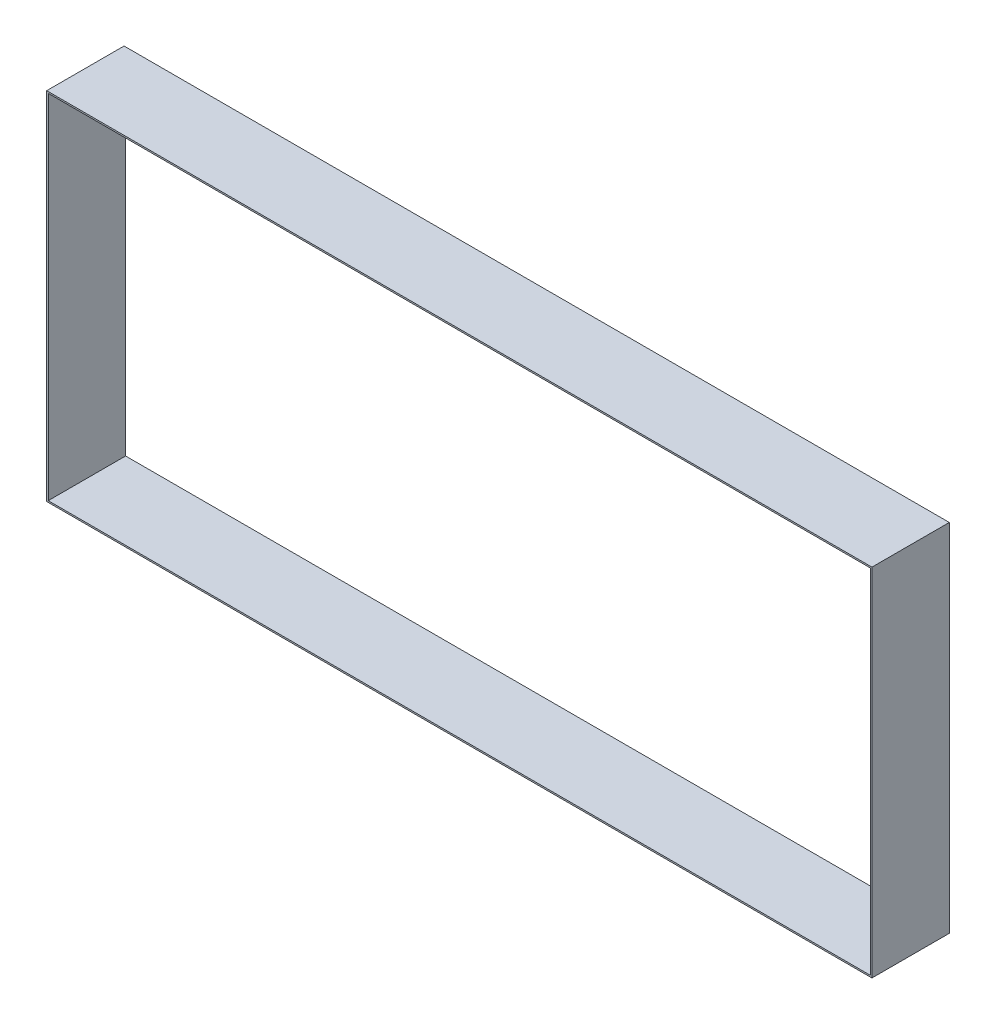
ISO-10303-21;
HEADER;
FILE_DESCRIPTION(('STEP AP214'),'2;1');
FILE_NAME('part.step','',(''),(''),'','','');
FILE_SCHEMA(('AUTOMOTIVE_DESIGN { 1 0 10303 214 1 1 1 1 }'));
ENDSEC;
DATA;
#1=APPLICATION_CONTEXT('core data for automotive mechanical design processes');
#2=APPLICATION_PROTOCOL_DEFINITION('international standard','automotive_design',2000,#1);
#3=PRODUCT_CONTEXT('',#1,'mechanical');
#4=PRODUCT('Part','Part','',(#3));
#5=PRODUCT_RELATED_PRODUCT_CATEGORY('part','',(#4));
#6=PRODUCT_DEFINITION_FORMATION('','',#4);
#7=PRODUCT_DEFINITION_CONTEXT('part definition',#1,'design');
#8=PRODUCT_DEFINITION('design','',#6,#7);
#9=PRODUCT_DEFINITION_SHAPE('','',#8);
#10=(LENGTH_UNIT() NAMED_UNIT(*) SI_UNIT(.MILLI.,.METRE.));
#11=(NAMED_UNIT(*) PLANE_ANGLE_UNIT() SI_UNIT($,.RADIAN.));
#12=(NAMED_UNIT(*) SI_UNIT($,.STERADIAN.) SOLID_ANGLE_UNIT());
#13=UNCERTAINTY_MEASURE_WITH_UNIT(LENGTH_MEASURE(1.E-05),#10,'distance_accuracy_value','');
#14=(GEOMETRIC_REPRESENTATION_CONTEXT(3) GLOBAL_UNCERTAINTY_ASSIGNED_CONTEXT((#13)) GLOBAL_UNIT_ASSIGNED_CONTEXT((#10,
#11,#12)) REPRESENTATION_CONTEXT('',''));
#15=CARTESIAN_POINT('',(0.,0.,0.));
#16=DIRECTION('',(0.,0.,1.));
#17=DIRECTION('',(1.,0.,0.));
#18=AXIS2_PLACEMENT_3D('',#15,#16,#17);
#19=CARTESIAN_POINT('',(0.,0.,50.));
#20=DIRECTION('',(0.,0.,1.));
#21=DIRECTION('',(1.,0.,0.));
#22=AXIS2_PLACEMENT_3D('',#19,#20,#21);
#23=PLANE('',#22);
#24=DIRECTION('',(0.,-1.,0.));
#25=VECTOR('',#24,1.);
#26=CARTESIAN_POINT('',(-57.8684020325567,31.1411992263056,50.));
#27=LINE('',#26,#25);
#28=CARTESIAN_POINT('',(-57.8684020325567,31.1411992263056,50.));
#29=VERTEX_POINT('',#28);
#30=CARTESIAN_POINT('',(-57.8684020325566,-198.858800773694,50.));
#31=VERTEX_POINT('',#30);
#32=EDGE_CURVE('E136',#29,#31,#27,.T.);
#33=ORIENTED_EDGE('',*,*,#32,.T.);
#34=DIRECTION('',(1.,0.,0.));
#35=VECTOR('',#34,1.);
#36=CARTESIAN_POINT('',(-57.8684020325566,-198.858800773694,50.));
#37=LINE('',#36,#35);
#38=CARTESIAN_POINT('',(475.531597967443,-198.858800773694,50.));
#39=VERTEX_POINT('',#38);
#40=EDGE_CURVE('E139',#31,#39,#37,.T.);
#41=ORIENTED_EDGE('',*,*,#40,.T.);
#42=DIRECTION('',(0.,1.,0.));
#43=VECTOR('',#42,1.);
#44=CARTESIAN_POINT('',(475.531597967443,31.1411992263056,50.));
#45=LINE('',#44,#43);
#46=CARTESIAN_POINT('',(475.531597967443,31.1411992263056,50.));
#47=VERTEX_POINT('',#46);
#48=EDGE_CURVE('E142',#39,#47,#45,.T.);
#49=ORIENTED_EDGE('',*,*,#48,.T.);
#50=DIRECTION('',(-1.,0.,0.));
#51=VECTOR('',#50,1.);
#52=CARTESIAN_POINT('',(-57.8684020325567,31.1411992263056,50.));
#53=LINE('',#52,#51);
#54=EDGE_CURVE('E144',#47,#29,#53,.T.);
#55=ORIENTED_EDGE('',*,*,#54,.T.);
#56=EDGE_LOOP('',(#33,#41,#49,#55));
#57=FACE_BOUND('',#56,.T.);
#58=DIRECTION('',(1.,0.,0.));
#59=VECTOR('',#58,1.);
#60=CARTESIAN_POINT('',(-56.8684020325567,-197.858800773694,50.));
#61=LINE('',#60,#59);
#62=CARTESIAN_POINT('',(-56.8684020325567,-197.858800773694,50.));
#63=VERTEX_POINT('',#62);
#64=CARTESIAN_POINT('',(474.531597967443,-197.858800773694,50.));
#65=VERTEX_POINT('',#64);
#66=EDGE_CURVE('E108',#63,#65,#61,.T.);
#67=ORIENTED_EDGE('',*,*,#66,.F.);
#68=DIRECTION('',(0.,-1.,0.));
#69=VECTOR('',#68,1.);
#70=CARTESIAN_POINT('',(-56.8684020325567,30.1411992263056,50.));
#71=LINE('',#70,#69);
#72=CARTESIAN_POINT('',(-56.8684020325567,30.1411992263056,50.));
#73=VERTEX_POINT('',#72);
#74=EDGE_CURVE('E100',#73,#63,#71,.T.);
#75=ORIENTED_EDGE('',*,*,#74,.F.);
#76=DIRECTION('',(-1.,0.,0.));
#77=VECTOR('',#76,1.);
#78=CARTESIAN_POINT('',(-56.8684020325567,30.1411992263056,50.));
#79=LINE('',#78,#77);
#80=CARTESIAN_POINT('',(474.531597967443,30.1411992263056,50.));
#81=VERTEX_POINT('',#80);
#82=EDGE_CURVE('E122',#81,#73,#79,.T.);
#83=ORIENTED_EDGE('',*,*,#82,.F.);
#84=DIRECTION('',(0.,1.,0.));
#85=VECTOR('',#84,1.);
#86=CARTESIAN_POINT('',(474.531597967443,30.1411992263056,50.));
#87=LINE('',#86,#85);
#88=EDGE_CURVE('E120',#65,#81,#87,.T.);
#89=ORIENTED_EDGE('',*,*,#88,.F.);
#90=EDGE_LOOP('',(#67,#75,#83,#89));
#91=FACE_BOUND('',#90,.T.);
#92=ADVANCED_FACE('F35',(#57,#91),#23,.T.);
#93=CARTESIAN_POINT('',(0.,0.,0.));
#94=DIRECTION('',(0.,0.,1.));
#95=DIRECTION('',(1.,0.,0.));
#96=AXIS2_PLACEMENT_3D('',#93,#94,#95);
#97=PLANE('',#96);
#98=DIRECTION('',(0.,-1.,0.));
#99=VECTOR('',#98,1.);
#100=CARTESIAN_POINT('',(-57.8684020325567,31.1411992263056,0.));
#101=LINE('',#100,#99);
#102=CARTESIAN_POINT('',(-57.8684020325567,31.1411992263056,0.));
#103=VERTEX_POINT('',#102);
#104=CARTESIAN_POINT('',(-57.8684020325566,-198.858800773694,0.));
#105=VERTEX_POINT('',#104);
#106=EDGE_CURVE('E116',#103,#105,#101,.T.);
#107=ORIENTED_EDGE('',*,*,#106,.F.);
#108=DIRECTION('',(-1.,0.,0.));
#109=VECTOR('',#108,1.);
#110=CARTESIAN_POINT('',(-57.8684020325567,31.1411992263056,0.));
#111=LINE('',#110,#109);
#112=CARTESIAN_POINT('',(475.531597967443,31.1411992263056,0.));
#113=VERTEX_POINT('',#112);
#114=EDGE_CURVE('E140',#113,#103,#111,.T.);
#115=ORIENTED_EDGE('',*,*,#114,.F.);
#116=DIRECTION('',(0.,1.,0.));
#117=VECTOR('',#116,1.);
#118=CARTESIAN_POINT('',(475.531597967443,31.1411992263056,0.));
#119=LINE('',#118,#117);
#120=CARTESIAN_POINT('',(475.531597967443,-198.858800773694,0.));
#121=VERTEX_POINT('',#120);
#122=EDGE_CURVE('E151',#121,#113,#119,.T.);
#123=ORIENTED_EDGE('',*,*,#122,.F.);
#124=DIRECTION('',(1.,0.,0.));
#125=VECTOR('',#124,1.);
#126=CARTESIAN_POINT('',(-57.8684020325566,-198.858800773694,0.));
#127=LINE('',#126,#125);
#128=EDGE_CURVE('E149',#105,#121,#127,.T.);
#129=ORIENTED_EDGE('',*,*,#128,.F.);
#130=EDGE_LOOP('',(#107,#115,#123,#129));
#131=FACE_BOUND('',#130,.T.);
#132=DIRECTION('',(0.,-1.,0.));
#133=VECTOR('',#132,1.);
#134=CARTESIAN_POINT('',(-56.8684020325567,30.1411992263056,0.));
#135=LINE('',#134,#133);
#136=CARTESIAN_POINT('',(-56.8684020325567,30.1411992263056,0.));
#137=VERTEX_POINT('',#136);
#138=CARTESIAN_POINT('',(-56.8684020325567,-197.858800773694,0.));
#139=VERTEX_POINT('',#138);
#140=EDGE_CURVE('E58',#137,#139,#135,.T.);
#141=ORIENTED_EDGE('',*,*,#140,.T.);
#142=DIRECTION('',(1.,0.,0.));
#143=VECTOR('',#142,1.);
#144=CARTESIAN_POINT('',(-56.8684020325567,-197.858800773694,0.));
#145=LINE('',#144,#143);
#146=CARTESIAN_POINT('',(474.531597967443,-197.858800773694,0.));
#147=VERTEX_POINT('',#146);
#148=EDGE_CURVE('E115',#139,#147,#145,.T.);
#149=ORIENTED_EDGE('',*,*,#148,.T.);
#150=DIRECTION('',(0.,1.,0.));
#151=VECTOR('',#150,1.);
#152=CARTESIAN_POINT('',(474.531597967443,30.1411992263056,0.));
#153=LINE('',#152,#151);
#154=CARTESIAN_POINT('',(474.531597967443,30.1411992263056,0.));
#155=VERTEX_POINT('',#154);
#156=EDGE_CURVE('E128',#147,#155,#153,.T.);
#157=ORIENTED_EDGE('',*,*,#156,.T.);
#158=DIRECTION('',(-1.,0.,0.));
#159=VECTOR('',#158,1.);
#160=CARTESIAN_POINT('',(-56.8684020325567,30.1411992263056,0.));
#161=LINE('',#160,#159);
#162=EDGE_CURVE('E109',#155,#137,#161,.T.);
#163=ORIENTED_EDGE('',*,*,#162,.T.);
#164=EDGE_LOOP('',(#141,#149,#157,#163));
#165=FACE_BOUND('',#164,.T.);
#166=ADVANCED_FACE('F169',(#131,#165),#97,.F.);
#167=CARTESIAN_POINT('',(-57.8684020325567,31.1411992263056,50.));
#168=DIRECTION('',(1.,0.,0.));
#169=DIRECTION('',(0.,1.,0.));
#170=AXIS2_PLACEMENT_3D('',#167,#168,#169);
#171=PLANE('',#170);
#172=ORIENTED_EDGE('',*,*,#106,.T.);
#173=DIRECTION('',(0.,0.,-1.));
#174=VECTOR('',#173,1.);
#175=CARTESIAN_POINT('',(-57.8684020325566,-198.858800773694,50.));
#176=LINE('',#175,#174);
#177=EDGE_CURVE('E11',#31,#105,#176,.T.);
#178=ORIENTED_EDGE('',*,*,#177,.F.);
#179=ORIENTED_EDGE('',*,*,#32,.F.);
#180=DIRECTION('',(0.,0.,-1.));
#181=VECTOR('',#180,1.);
#182=CARTESIAN_POINT('',(-57.8684020325567,31.1411992263056,50.));
#183=LINE('',#182,#181);
#184=EDGE_CURVE('E146',#29,#103,#183,.T.);
#185=ORIENTED_EDGE('',*,*,#184,.T.);
#186=EDGE_LOOP('',(#172,#178,#179,#185));
#187=FACE_BOUND('',#186,.T.);
#188=ADVANCED_FACE('F37',(#187),#171,.F.);
#189=CARTESIAN_POINT('',(-57.8684020325566,-198.858800773694,50.));
#190=DIRECTION('',(0.,1.,0.));
#191=DIRECTION('',(0.,0.,1.));
#192=AXIS2_PLACEMENT_3D('',#189,#190,#191);
#193=PLANE('',#192);
#194=ORIENTED_EDGE('',*,*,#128,.T.);
#195=DIRECTION('',(0.,0.,-1.));
#196=VECTOR('',#195,1.);
#197=CARTESIAN_POINT('',(475.531597967443,-198.858800773694,50.));
#198=LINE('',#197,#196);
#199=EDGE_CURVE('E43',#39,#121,#198,.T.);
#200=ORIENTED_EDGE('',*,*,#199,.F.);
#201=ORIENTED_EDGE('',*,*,#40,.F.);
#202=ORIENTED_EDGE('',*,*,#177,.T.);
#203=EDGE_LOOP('',(#194,#200,#201,#202));
#204=FACE_BOUND('',#203,.T.);
#205=ADVANCED_FACE('F179',(#204),#193,.F.);
#206=CARTESIAN_POINT('',(475.531597967443,31.1411992263056,50.));
#207=DIRECTION('',(-1.,0.,0.));
#208=DIRECTION('',(0.,0.,1.));
#209=AXIS2_PLACEMENT_3D('',#206,#207,#208);
#210=PLANE('',#209);
#211=ORIENTED_EDGE('',*,*,#122,.T.);
#212=DIRECTION('',(0.,0.,-1.));
#213=VECTOR('',#212,1.);
#214=CARTESIAN_POINT('',(475.531597967443,31.1411992263056,50.));
#215=LINE('',#214,#213);
#216=EDGE_CURVE('E156',#47,#113,#215,.T.);
#217=ORIENTED_EDGE('',*,*,#216,.F.);
#218=ORIENTED_EDGE('',*,*,#48,.F.);
#219=ORIENTED_EDGE('',*,*,#199,.T.);
#220=EDGE_LOOP('',(#211,#217,#218,#219));
#221=FACE_BOUND('',#220,.T.);
#222=ADVANCED_FACE('F163',(#221),#210,.F.);
#223=CARTESIAN_POINT('',(-57.8684020325567,31.1411992263056,50.));
#224=DIRECTION('',(0.,-1.,0.));
#225=DIRECTION('',(0.,0.,-1.));
#226=AXIS2_PLACEMENT_3D('',#223,#224,#225);
#227=PLANE('',#226);
#228=ORIENTED_EDGE('',*,*,#114,.T.);
#229=ORIENTED_EDGE('',*,*,#184,.F.);
#230=ORIENTED_EDGE('',*,*,#54,.F.);
#231=ORIENTED_EDGE('',*,*,#216,.T.);
#232=EDGE_LOOP('',(#228,#229,#230,#231));
#233=FACE_BOUND('',#232,.T.);
#234=ADVANCED_FACE('F173',(#233),#227,.F.);
#235=CARTESIAN_POINT('',(-56.8684020325567,30.1411992263056,50.));
#236=DIRECTION('',(1.,0.,0.));
#237=DIRECTION('',(0.,1.,0.));
#238=AXIS2_PLACEMENT_3D('',#235,#236,#237);
#239=PLANE('',#238);
#240=ORIENTED_EDGE('',*,*,#140,.F.);
#241=DIRECTION('',(0.,0.,-1.));
#242=VECTOR('',#241,1.);
#243=CARTESIAN_POINT('',(-56.8684020325567,30.1411992263056,50.));
#244=LINE('',#243,#242);
#245=EDGE_CURVE('E104',#73,#137,#244,.T.);
#246=ORIENTED_EDGE('',*,*,#245,.F.);
#247=ORIENTED_EDGE('',*,*,#74,.T.);
#248=DIRECTION('',(0.,0.,-1.));
#249=VECTOR('',#248,1.);
#250=CARTESIAN_POINT('',(-56.8684020325567,-197.858800773694,50.));
#251=LINE('',#250,#249);
#252=EDGE_CURVE('E103',#63,#139,#251,.T.);
#253=ORIENTED_EDGE('',*,*,#252,.T.);
#254=EDGE_LOOP('',(#240,#246,#247,#253));
#255=FACE_BOUND('',#254,.T.);
#256=ADVANCED_FACE('F102',(#255),#239,.T.);
#257=CARTESIAN_POINT('',(-56.8684020325567,-197.858800773694,50.));
#258=DIRECTION('',(0.,1.,0.));
#259=DIRECTION('',(0.,0.,1.));
#260=AXIS2_PLACEMENT_3D('',#257,#258,#259);
#261=PLANE('',#260);
#262=ORIENTED_EDGE('',*,*,#148,.F.);
#263=ORIENTED_EDGE('',*,*,#252,.F.);
#264=ORIENTED_EDGE('',*,*,#66,.T.);
#265=DIRECTION('',(0.,0.,-1.));
#266=VECTOR('',#265,1.);
#267=CARTESIAN_POINT('',(474.531597967443,-197.858800773694,50.));
#268=LINE('',#267,#266);
#269=EDGE_CURVE('E117',#65,#147,#268,.T.);
#270=ORIENTED_EDGE('',*,*,#269,.T.);
#271=EDGE_LOOP('',(#262,#263,#264,#270));
#272=FACE_BOUND('',#271,.T.);
#273=ADVANCED_FACE('F112',(#272),#261,.T.);
#274=CARTESIAN_POINT('',(474.531597967443,30.1411992263056,50.));
#275=DIRECTION('',(-1.,0.,0.));
#276=DIRECTION('',(0.,0.,1.));
#277=AXIS2_PLACEMENT_3D('',#274,#275,#276);
#278=PLANE('',#277);
#279=ORIENTED_EDGE('',*,*,#156,.F.);
#280=ORIENTED_EDGE('',*,*,#269,.F.);
#281=ORIENTED_EDGE('',*,*,#88,.T.);
#282=DIRECTION('',(0.,0.,-1.));
#283=VECTOR('',#282,1.);
#284=CARTESIAN_POINT('',(474.531597967443,30.1411992263056,50.));
#285=LINE('',#284,#283);
#286=EDGE_CURVE('E50',#81,#155,#285,.T.);
#287=ORIENTED_EDGE('',*,*,#286,.T.);
#288=EDGE_LOOP('',(#279,#280,#281,#287));
#289=FACE_BOUND('',#288,.T.);
#290=ADVANCED_FACE('F202',(#289),#278,.T.);
#291=CARTESIAN_POINT('',(-56.8684020325567,30.1411992263056,50.));
#292=DIRECTION('',(0.,-1.,0.));
#293=DIRECTION('',(0.,0.,-1.));
#294=AXIS2_PLACEMENT_3D('',#291,#292,#293);
#295=PLANE('',#294);
#296=ORIENTED_EDGE('',*,*,#162,.F.);
#297=ORIENTED_EDGE('',*,*,#286,.F.);
#298=ORIENTED_EDGE('',*,*,#82,.T.);
#299=ORIENTED_EDGE('',*,*,#245,.T.);
#300=EDGE_LOOP('',(#296,#297,#298,#299));
#301=FACE_BOUND('',#300,.T.);
#302=ADVANCED_FACE('F206',(#301),#295,.T.);
#303=CLOSED_SHELL('',(#92,#166,#188,#205,#222,#234,#256,#273,#290,#302));
#304=MANIFOLD_SOLID_BREP('B2',#303);
#305=ADVANCED_BREP_SHAPE_REPRESENTATION('',(#18,#304),#14);
#306=SHAPE_DEFINITION_REPRESENTATION(#9,#305);
ENDSEC;
END-ISO-10303-21;
